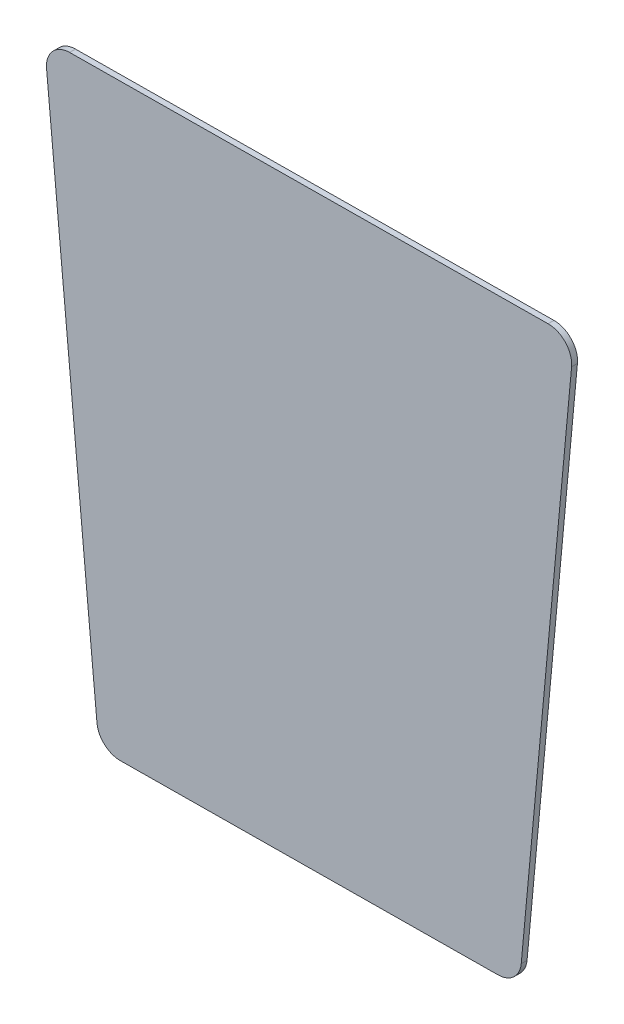
ISO-10303-21;
HEADER;
FILE_DESCRIPTION(('STEP AP214'),'2;1');
FILE_NAME('part.step','',(''),(''),'','','');
FILE_SCHEMA(('AUTOMOTIVE_DESIGN { 1 0 10303 214 1 1 1 1 }'));
ENDSEC;
DATA;
#1=APPLICATION_CONTEXT('core data for automotive mechanical design processes');
#2=APPLICATION_PROTOCOL_DEFINITION('international standard','automotive_design',2000,#1);
#3=PRODUCT_CONTEXT('',#1,'mechanical');
#4=PRODUCT('Part','Part','',(#3));
#5=PRODUCT_RELATED_PRODUCT_CATEGORY('part','',(#4));
#6=PRODUCT_DEFINITION_FORMATION('','',#4);
#7=PRODUCT_DEFINITION_CONTEXT('part definition',#1,'design');
#8=PRODUCT_DEFINITION('design','',#6,#7);
#9=PRODUCT_DEFINITION_SHAPE('','',#8);
#10=(LENGTH_UNIT() NAMED_UNIT(*) SI_UNIT(.MILLI.,.METRE.));
#11=(NAMED_UNIT(*) PLANE_ANGLE_UNIT() SI_UNIT($,.RADIAN.));
#12=(NAMED_UNIT(*) SI_UNIT($,.STERADIAN.) SOLID_ANGLE_UNIT());
#13=UNCERTAINTY_MEASURE_WITH_UNIT(LENGTH_MEASURE(1.E-05),#10,'distance_accuracy_value','');
#14=(GEOMETRIC_REPRESENTATION_CONTEXT(3) GLOBAL_UNCERTAINTY_ASSIGNED_CONTEXT((#13)) GLOBAL_UNIT_ASSIGNED_CONTEXT((#10,
#11,#12)) REPRESENTATION_CONTEXT('',''));
#15=CARTESIAN_POINT('',(0.,0.,0.));
#16=DIRECTION('',(0.,0.,1.));
#17=DIRECTION('',(1.,0.,0.));
#18=AXIS2_PLACEMENT_3D('',#15,#16,#17);
#19=CARTESIAN_POINT('',(114.199047438668,114.267866307366,1357.050334154));
#20=DIRECTION('',(-0.00884097115189775,0.999960917850838,0.));
#21=DIRECTION('',(-0.999960917850839,-0.00884097115189775,0.));
#22=AXIS2_PLACEMENT_3D('',#19,#20,#21);
#23=PLANE('',#22);
#24=DIRECTION('',(0.999960917850839,0.00884097115189775,0.));
#25=VECTOR('',#24,1.);
#26=CARTESIAN_POINT('',(114.199047438668,114.267866307366,1357.050334154));
#27=LINE('',#26,#25);
#28=CARTESIAN_POINT('',(-102.523487327425,112.351753743736,1357.050334154));
#29=VERTEX_POINT('',#28);
#30=CARTESIAN_POINT('',(102.727195103214,114.166440027852,1357.050334154));
#31=VERTEX_POINT('',#30);
#32=EDGE_CURVE('E124',#29,#31,#27,.T.);
#33=ORIENTED_EDGE('',*,*,#32,.F.);
#34=DIRECTION('',(0.,0.,-1.));
#35=VECTOR('',#34,1.);
#36=CARTESIAN_POINT('',(-102.523487327425,112.351753743736,1357.050334154));
#37=LINE('',#36,#35);
#38=CARTESIAN_POINT('',(-102.523487327425,112.351753743736,1353.875334154));
#39=VERTEX_POINT('',#38);
#40=EDGE_CURVE('E109',#29,#39,#37,.T.);
#41=ORIENTED_EDGE('',*,*,#40,.T.);
#42=DIRECTION('',(0.999960917850839,0.00884097115189775,0.));
#43=VECTOR('',#42,1.);
#44=CARTESIAN_POINT('',(114.199047438668,114.267866307366,1353.875334154));
#45=LINE('',#44,#43);
#46=CARTESIAN_POINT('',(102.727195103214,114.166440027852,1353.875334154));
#47=VERTEX_POINT('',#46);
#48=EDGE_CURVE('E121',#39,#47,#45,.T.);
#49=ORIENTED_EDGE('',*,*,#48,.T.);
#50=DIRECTION('',(0.,0.,-1.));
#51=VECTOR('',#50,1.);
#52=CARTESIAN_POINT('',(102.727195103214,114.166440027852,1357.050334154));
#53=LINE('',#52,#51);
#54=EDGE_CURVE('E126',#47,#31,#53,.F.);
#55=ORIENTED_EDGE('',*,*,#54,.T.);
#56=EDGE_LOOP('',(#33,#41,#49,#55));
#57=FACE_BOUND('',#56,.T.);
#58=ADVANCED_FACE('F39',(#57),#23,.F.);
#59=CARTESIAN_POINT('',(143.93508402983,434.296681189862,1357.050334154));
#60=DIRECTION('',(-0.995710991059937,0.0925182267579597,0.));
#61=DIRECTION('',(-0.0925182267579598,-0.995710991059938,0.));
#62=AXIS2_PLACEMENT_3D('',#59,#60,#61);
#63=PLANE('',#62);
#64=DIRECTION('',(0.0925182267579598,0.995710991059937,0.));
#65=VECTOR('',#64,1.);
#66=CARTESIAN_POINT('',(143.93508402983,434.296681189862,1353.875334154));
#67=LINE('',#66,#65);
#68=CARTESIAN_POINT('',(115.260444356046,125.690962204732,1353.875334154));
#69=VERTEX_POINT('',#68);
#70=CARTESIAN_POINT('',(142.634283386649,420.297045194015,1353.875334154));
#71=VERTEX_POINT('',#70);
#72=EDGE_CURVE('E131',#69,#71,#67,.T.);
#73=ORIENTED_EDGE('',*,*,#72,.T.);
#74=DIRECTION('',(0.,0.,-1.));
#75=VECTOR('',#74,1.);
#76=CARTESIAN_POINT('',(142.634283386649,420.297045194015,1357.050334154));
#77=LINE('',#76,#75);
#78=CARTESIAN_POINT('',(142.634283386649,420.297045194015,1357.050334154));
#79=VERTEX_POINT('',#78);
#80=EDGE_CURVE('E11',#71,#79,#77,.F.);
#81=ORIENTED_EDGE('',*,*,#80,.T.);
#82=DIRECTION('',(0.0925182267579598,0.995710991059937,0.));
#83=VECTOR('',#82,1.);
#84=CARTESIAN_POINT('',(143.93508402983,434.296681189862,1357.050334154));
#85=LINE('',#84,#83);
#86=CARTESIAN_POINT('',(115.260444356046,125.690962204732,1357.050334154));
#87=VERTEX_POINT('',#86);
#88=EDGE_CURVE('E166',#87,#79,#85,.T.);
#89=ORIENTED_EDGE('',*,*,#88,.F.);
#90=DIRECTION('',(0.,0.,-1.));
#91=VECTOR('',#90,1.);
#92=CARTESIAN_POINT('',(115.260444356046,125.690962204732,1357.050334154));
#93=LINE('',#92,#91);
#94=EDGE_CURVE('E47',#87,#69,#93,.T.);
#95=ORIENTED_EDGE('',*,*,#94,.T.);
#96=EDGE_LOOP('',(#73,#81,#89,#95));
#97=FACE_BOUND('',#96,.T.);
#98=ADVANCED_FACE('F164',(#97),#63,.F.);
#99=CARTESIAN_POINT('',(-143.93508402983,431.734038744227,1357.050334154));
#100=DIRECTION('',(0.00890172444094434,-0.999960378866072,0.));
#101=DIRECTION('',(0.999960378866072,0.00890172444094434,0.));
#102=AXIS2_PLACEMENT_3D('',#99,#100,#101);
#103=PLANE('',#102);
#104=DIRECTION('',(-0.999960378866072,-0.00890172444094434,0.));
#105=VECTOR('',#104,1.);
#106=CARTESIAN_POINT('',(-143.93508402983,431.734038744227,1357.050334154));
#107=LINE('',#106,#105);
#108=CARTESIAN_POINT('',(129.875701899788,434.17152348544,1357.050334154));
#109=VERTEX_POINT('',#108);
#110=CARTESIAN_POINT('',(-130.122686866009,431.856997769424,1357.050334154));
#111=VERTEX_POINT('',#110);
#112=EDGE_CURVE('E174',#109,#111,#107,.T.);
#113=ORIENTED_EDGE('',*,*,#112,.F.);
#114=DIRECTION('',(0.,0.,-1.));
#115=VECTOR('',#114,1.);
#116=CARTESIAN_POINT('',(129.875701899788,434.17152348544,1357.050334154));
#117=LINE('',#116,#115);
#118=CARTESIAN_POINT('',(129.875701899788,434.17152348544,1353.875334154));
#119=VERTEX_POINT('',#118);
#120=EDGE_CURVE('E158',#109,#119,#117,.T.);
#121=ORIENTED_EDGE('',*,*,#120,.T.);
#122=DIRECTION('',(-0.999960378866072,-0.00890172444094434,0.));
#123=VECTOR('',#122,1.);
#124=CARTESIAN_POINT('',(-143.93508402983,431.734038744227,1353.875334154));
#125=LINE('',#124,#123);
#126=CARTESIAN_POINT('',(-130.122686866009,431.856997769424,1353.875334154));
#127=VERTEX_POINT('',#126);
#128=EDGE_CURVE('E134',#119,#127,#125,.T.);
#129=ORIENTED_EDGE('',*,*,#128,.T.);
#130=DIRECTION('',(0.,0.,-1.));
#131=VECTOR('',#130,1.);
#132=CARTESIAN_POINT('',(-130.122686866009,431.856997769424,1357.050334154));
#133=LINE('',#132,#131);
#134=EDGE_CURVE('E54',#127,#111,#133,.F.);
#135=ORIENTED_EDGE('',*,*,#134,.T.);
#136=EDGE_LOOP('',(#113,#121,#129,#135));
#137=FACE_BOUND('',#136,.T.);
#138=ADVANCED_FACE('F173',(#137),#103,.F.);
#139=CARTESIAN_POINT('',(-114.199047438668,112.248526419264,1357.050334154));
#140=DIRECTION('',(0.995696485379504,0.0926742089413434,0.));
#141=DIRECTION('',(-0.0926742089413434,0.995696485379504,0.));
#142=AXIS2_PLACEMENT_3D('',#139,#140,#141);
#143=PLANE('',#142);
#144=DIRECTION('',(0.0926742089413434,-0.995696485379504,0.));
#145=VECTOR('',#144,1.);
#146=CARTESIAN_POINT('',(-114.199047438668,112.248526419264,1353.875334154));
#147=LINE('',#146,#145);
#148=CARTESIAN_POINT('',(-142.654980329929,417.98053850427,1353.875334154));
#149=VERTEX_POINT('',#148);
#150=CARTESIAN_POINT('',(-115.281113025374,123.874294946886,1353.875334154));
#151=VERTEX_POINT('',#150);
#152=EDGE_CURVE('E141',#149,#151,#147,.T.);
#153=ORIENTED_EDGE('',*,*,#152,.T.);
#154=DIRECTION('',(0.,0.,-1.));
#155=VECTOR('',#154,1.);
#156=CARTESIAN_POINT('',(-115.281113025374,123.874294946886,1357.050334154));
#157=LINE('',#156,#155);
#158=CARTESIAN_POINT('',(-115.281113025374,123.874294946886,1357.050334154));
#159=VERTEX_POINT('',#158);
#160=EDGE_CURVE('E110',#151,#159,#157,.F.);
#161=ORIENTED_EDGE('',*,*,#160,.T.);
#162=DIRECTION('',(0.0926742089413434,-0.995696485379504,0.));
#163=VECTOR('',#162,1.);
#164=CARTESIAN_POINT('',(-114.199047438668,112.248526419264,1357.050334154));
#165=LINE('',#164,#163);
#166=CARTESIAN_POINT('',(-142.654980329929,417.98053850427,1357.050334154));
#167=VERTEX_POINT('',#166);
#168=EDGE_CURVE('E137',#167,#159,#165,.T.);
#169=ORIENTED_EDGE('',*,*,#168,.F.);
#170=DIRECTION('',(0.,0.,-1.));
#171=VECTOR('',#170,1.);
#172=CARTESIAN_POINT('',(-142.654980329929,417.98053850427,1357.050334154));
#173=LINE('',#172,#171);
#174=EDGE_CURVE('E115',#167,#149,#173,.T.);
#175=ORIENTED_EDGE('',*,*,#174,.T.);
#176=EDGE_LOOP('',(#153,#161,#169,#175));
#177=FACE_BOUND('',#176,.T.);
#178=ADVANCED_FACE('F204',(#177),#143,.F.);
#179=CARTESIAN_POINT('',(0.,0.,1357.050334154));
#180=DIRECTION('',(0.,0.,-1.));
#181=DIRECTION('',(-1.,0.,0.));
#182=AXIS2_PLACEMENT_3D('',#179,#180,#181);
#183=PLANE('',#182);
#184=ORIENTED_EDGE('',*,*,#168,.T.);
#185=CARTESIAN_POINT('',(-102.635767661054,125.051257400441,1357.050334154));
#186=DIRECTION('',(0.,0.,-1.));
#187=DIRECTION('',(-1.,0.,0.));
#188=AXIS2_PLACEMENT_3D('',#185,#186,#187);
#189=CIRCLE('',#188,12.7);
#190=EDGE_CURVE('E155',#159,#29,#189,.F.);
#191=ORIENTED_EDGE('',*,*,#190,.T.);
#192=ORIENTED_EDGE('',*,*,#32,.T.);
#193=CARTESIAN_POINT('',(102.614914769585,126.865943684558,1357.050334154));
#194=DIRECTION('',(0.,0.,-1.));
#195=DIRECTION('',(-1.,0.,0.));
#196=AXIS2_PLACEMENT_3D('',#193,#194,#195);
#197=CIRCLE('',#196,12.7);
#198=EDGE_CURVE('E152',#31,#87,#197,.F.);
#199=ORIENTED_EDGE('',*,*,#198,.T.);
#200=ORIENTED_EDGE('',*,*,#88,.T.);
#201=CARTESIAN_POINT('',(129.988753800188,421.472026673841,1357.050334154));
#202=DIRECTION('',(0.,0.,-1.));
#203=DIRECTION('',(-1.,0.,0.));
#204=AXIS2_PLACEMENT_3D('',#201,#202,#203);
#205=CIRCLE('',#204,12.7);
#206=EDGE_CURVE('E61',#79,#109,#205,.F.);
#207=ORIENTED_EDGE('',*,*,#206,.T.);
#208=ORIENTED_EDGE('',*,*,#112,.T.);
#209=CARTESIAN_POINT('',(-130.009634965609,419.157500957825,1357.050334154));
#210=DIRECTION('',(0.,0.,-1.));
#211=DIRECTION('',(-1.,0.,0.));
#212=AXIS2_PLACEMENT_3D('',#209,#210,#211);
#213=CIRCLE('',#212,12.7);
#214=EDGE_CURVE('E150',#111,#167,#213,.F.);
#215=ORIENTED_EDGE('',*,*,#214,.T.);
#216=EDGE_LOOP('',(#184,#191,#192,#199,#200,#207,#208,#215));
#217=FACE_BOUND('',#216,.T.);
#218=ADVANCED_FACE('F179',(#217),#183,.F.);
#219=CARTESIAN_POINT('',(0.,0.,1353.875334154));
#220=DIRECTION('',(0.,0.,-1.));
#221=DIRECTION('',(-1.,0.,0.));
#222=AXIS2_PLACEMENT_3D('',#219,#220,#221);
#223=PLANE('',#222);
#224=ORIENTED_EDGE('',*,*,#48,.F.);
#225=CARTESIAN_POINT('',(-102.635767661054,125.051257400441,1353.875334154));
#226=DIRECTION('',(0.,0.,-1.));
#227=DIRECTION('',(-1.,0.,0.));
#228=AXIS2_PLACEMENT_3D('',#225,#226,#227);
#229=CIRCLE('',#228,12.7);
#230=EDGE_CURVE('E105',#39,#151,#229,.T.);
#231=ORIENTED_EDGE('',*,*,#230,.T.);
#232=ORIENTED_EDGE('',*,*,#152,.F.);
#233=CARTESIAN_POINT('',(-130.009634965609,419.157500957825,1353.875334154));
#234=DIRECTION('',(0.,0.,-1.));
#235=DIRECTION('',(-1.,0.,0.));
#236=AXIS2_PLACEMENT_3D('',#233,#234,#235);
#237=CIRCLE('',#236,12.7);
#238=EDGE_CURVE('E125',#149,#127,#237,.T.);
#239=ORIENTED_EDGE('',*,*,#238,.T.);
#240=ORIENTED_EDGE('',*,*,#128,.F.);
#241=CARTESIAN_POINT('',(129.988753800188,421.472026673841,1353.875334154));
#242=DIRECTION('',(0.,0.,-1.));
#243=DIRECTION('',(-1.,0.,0.));
#244=AXIS2_PLACEMENT_3D('',#241,#242,#243);
#245=CIRCLE('',#244,12.7);
#246=EDGE_CURVE('E116',#119,#71,#245,.T.);
#247=ORIENTED_EDGE('',*,*,#246,.T.);
#248=ORIENTED_EDGE('',*,*,#72,.F.);
#249=CARTESIAN_POINT('',(102.614914769585,126.865943684558,1353.875334154));
#250=DIRECTION('',(0.,0.,-1.));
#251=DIRECTION('',(-1.,0.,0.));
#252=AXIS2_PLACEMENT_3D('',#249,#250,#251);
#253=CIRCLE('',#252,12.7);
#254=EDGE_CURVE('E130',#69,#47,#253,.T.);
#255=ORIENTED_EDGE('',*,*,#254,.T.);
#256=EDGE_LOOP('',(#224,#231,#232,#239,#240,#247,#248,#255));
#257=FACE_BOUND('',#256,.T.);
#258=ADVANCED_FACE('F128',(#257),#223,.T.);
#259=CARTESIAN_POINT('',(-102.635767661054,125.051257400441,1357.050334154));
#260=DIRECTION('',(0.,0.,-1.));
#261=DIRECTION('',(-1.,0.,0.));
#262=AXIS2_PLACEMENT_3D('',#259,#260,#261);
#263=CYLINDRICAL_SURFACE('',#262,12.7);
#264=ORIENTED_EDGE('',*,*,#190,.F.);
#265=ORIENTED_EDGE('',*,*,#160,.F.);
#266=ORIENTED_EDGE('',*,*,#230,.F.);
#267=ORIENTED_EDGE('',*,*,#40,.F.);
#268=EDGE_LOOP('',(#264,#265,#266,#267));
#269=FACE_BOUND('',#268,.T.);
#270=ADVANCED_FACE('F108',(#269),#263,.T.);
#271=CARTESIAN_POINT('',(129.988753800188,421.472026673841,1357.050334154));
#272=DIRECTION('',(0.,0.,-1.));
#273=DIRECTION('',(-1.,0.,0.));
#274=AXIS2_PLACEMENT_3D('',#271,#272,#273);
#275=CYLINDRICAL_SURFACE('',#274,12.7);
#276=ORIENTED_EDGE('',*,*,#206,.F.);
#277=ORIENTED_EDGE('',*,*,#80,.F.);
#278=ORIENTED_EDGE('',*,*,#246,.F.);
#279=ORIENTED_EDGE('',*,*,#120,.F.);
#280=EDGE_LOOP('',(#276,#277,#278,#279));
#281=FACE_BOUND('',#280,.T.);
#282=ADVANCED_FACE('F172',(#281),#275,.T.);
#283=CARTESIAN_POINT('',(102.614914769585,126.865943684558,1357.050334154));
#284=DIRECTION('',(0.,0.,-1.));
#285=DIRECTION('',(-1.,0.,0.));
#286=AXIS2_PLACEMENT_3D('',#283,#284,#285);
#287=CYLINDRICAL_SURFACE('',#286,12.7);
#288=ORIENTED_EDGE('',*,*,#198,.F.);
#289=ORIENTED_EDGE('',*,*,#54,.F.);
#290=ORIENTED_EDGE('',*,*,#254,.F.);
#291=ORIENTED_EDGE('',*,*,#94,.F.);
#292=EDGE_LOOP('',(#288,#289,#290,#291));
#293=FACE_BOUND('',#292,.T.);
#294=ADVANCED_FACE('F180',(#293),#287,.T.);
#295=CARTESIAN_POINT('',(-130.009634965609,419.157500957825,1357.050334154));
#296=DIRECTION('',(0.,0.,-1.));
#297=DIRECTION('',(-1.,0.,0.));
#298=AXIS2_PLACEMENT_3D('',#295,#296,#297);
#299=CYLINDRICAL_SURFACE('',#298,12.7);
#300=ORIENTED_EDGE('',*,*,#214,.F.);
#301=ORIENTED_EDGE('',*,*,#134,.F.);
#302=ORIENTED_EDGE('',*,*,#238,.F.);
#303=ORIENTED_EDGE('',*,*,#174,.F.);
#304=EDGE_LOOP('',(#300,#301,#302,#303));
#305=FACE_BOUND('',#304,.T.);
#306=ADVANCED_FACE('F41',(#305),#299,.T.);
#307=CLOSED_SHELL('',(#58,#98,#138,#178,#218,#258,#270,#282,#294,#306));
#308=MANIFOLD_SOLID_BREP('B2',#307);
#309=ADVANCED_BREP_SHAPE_REPRESENTATION('',(#18,#308),#14);
#310=SHAPE_DEFINITION_REPRESENTATION(#9,#309);
ENDSEC;
END-ISO-10303-21;
